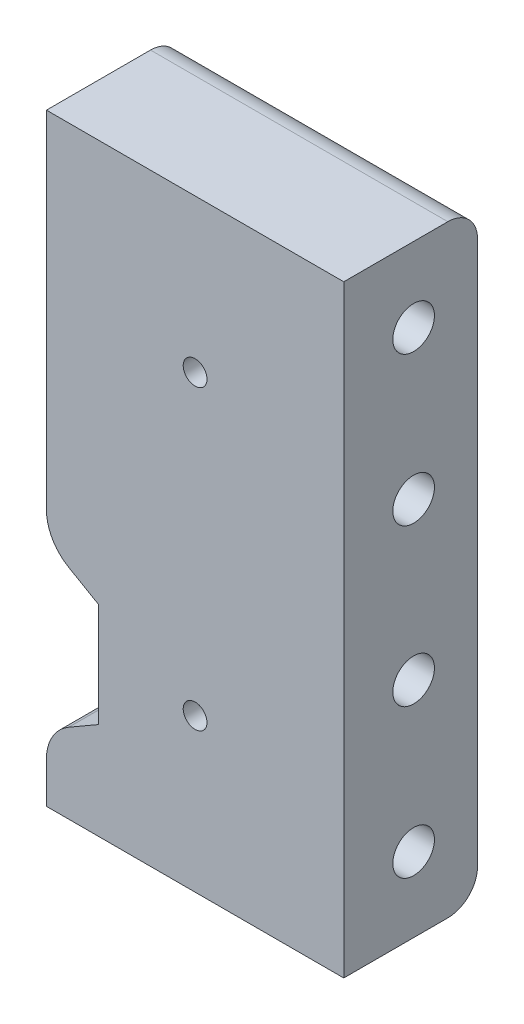
ISO-10303-21;
HEADER;
FILE_DESCRIPTION(('STEP AP214'),'2;1');
FILE_NAME('part.step','',(''),(''),'','','');
FILE_SCHEMA(('AUTOMOTIVE_DESIGN { 1 0 10303 214 1 1 1 1 }'));
ENDSEC;
DATA;
#1=APPLICATION_CONTEXT('core data for automotive mechanical design processes');
#2=APPLICATION_PROTOCOL_DEFINITION('international standard','automotive_design',2000,#1);
#3=PRODUCT_CONTEXT('',#1,'mechanical');
#4=PRODUCT('Part','Part','',(#3));
#5=PRODUCT_RELATED_PRODUCT_CATEGORY('part','',(#4));
#6=PRODUCT_DEFINITION_FORMATION('','',#4);
#7=PRODUCT_DEFINITION_CONTEXT('part definition',#1,'design');
#8=PRODUCT_DEFINITION('design','',#6,#7);
#9=PRODUCT_DEFINITION_SHAPE('','',#8);
#10=(LENGTH_UNIT() NAMED_UNIT(*) SI_UNIT(.MILLI.,.METRE.));
#11=(NAMED_UNIT(*) PLANE_ANGLE_UNIT() SI_UNIT($,.RADIAN.));
#12=(NAMED_UNIT(*) SI_UNIT($,.STERADIAN.) SOLID_ANGLE_UNIT());
#13=UNCERTAINTY_MEASURE_WITH_UNIT(LENGTH_MEASURE(1.E-05),#10,'distance_accuracy_value','');
#14=(GEOMETRIC_REPRESENTATION_CONTEXT(3) GLOBAL_UNCERTAINTY_ASSIGNED_CONTEXT((#13)) GLOBAL_UNIT_ASSIGNED_CONTEXT((#10,
#11,#12)) REPRESENTATION_CONTEXT('',''));
#15=CARTESIAN_POINT('',(0.,0.,0.));
#16=DIRECTION('',(0.,0.,1.));
#17=DIRECTION('',(1.,0.,0.));
#18=AXIS2_PLACEMENT_3D('',#15,#16,#17);
#19=CARTESIAN_POINT('',(-10.,20.28038,-9.));
#20=DIRECTION('',(-1.,0.,0.));
#21=DIRECTION('',(0.,-1.,0.));
#22=AXIS2_PLACEMENT_3D('',#19,#20,#21);
#23=PLANE('',#22);
#24=DIRECTION('',(0.,-1.,0.));
#25=VECTOR('',#24,1.);
#26=CARTESIAN_POINT('',(-10.,20.28038,-18.));
#27=LINE('',#26,#25);
#28=CARTESIAN_POINT('',(-10.,-17.5179467497326,-18.));
#29=VERTEX_POINT('',#28);
#30=CARTESIAN_POINT('',(-10.,-18.28038,-18.));
#31=VERTEX_POINT('',#30);
#32=EDGE_CURVE('E286',#29,#31,#27,.T.);
#33=ORIENTED_EDGE('',*,*,#32,.T.);
#34=CARTESIAN_POINT('',(-10.,-18.28038,-16.));
#35=DIRECTION('',(1.,0.,0.));
#36=DIRECTION('',(0.,-1.,0.));
#37=AXIS2_PLACEMENT_3D('',#34,#35,#36);
#38=CIRCLE('',#37,2.);
#39=CARTESIAN_POINT('',(-10.,-20.28038,-16.));
#40=VERTEX_POINT('',#39);
#41=EDGE_CURVE('E387',#40,#31,#38,.T.);
#42=ORIENTED_EDGE('',*,*,#41,.F.);
#43=DIRECTION('',(0.,0.,-1.));
#44=VECTOR('',#43,1.);
#45=CARTESIAN_POINT('',(-10.,-20.28038,-9.));
#46=LINE('',#45,#44);
#47=CARTESIAN_POINT('',(-10.,-20.28038,-9.));
#48=VERTEX_POINT('',#47);
#49=EDGE_CURVE('E332',#48,#40,#46,.T.);
#50=ORIENTED_EDGE('',*,*,#49,.F.);
#51=DIRECTION('',(0.,-1.,0.));
#52=VECTOR('',#51,1.);
#53=CARTESIAN_POINT('',(-10.,20.28038,-9.));
#54=LINE('',#53,#52);
#55=CARTESIAN_POINT('',(-10.,-17.5179467497326,-9.));
#56=VERTEX_POINT('',#55);
#57=EDGE_CURVE('E310',#56,#48,#54,.T.);
#58=ORIENTED_EDGE('',*,*,#57,.F.);
#59=DIRECTION('',(0.,0.,1.));
#60=VECTOR('',#59,1.);
#61=CARTESIAN_POINT('',(-10.,-17.5179467497326,-9.00000000000001));
#62=LINE('',#61,#60);
#63=EDGE_CURVE('E40',#29,#56,#62,.T.);
#64=ORIENTED_EDGE('',*,*,#63,.F.);
#65=EDGE_LOOP('',(#33,#42,#50,#58,#64));
#66=FACE_BOUND('',#65,.T.);
#67=ADVANCED_FACE('F32',(#66),#23,.T.);
#68=CARTESIAN_POINT('',(0.,0.,-18.));
#69=DIRECTION('',(0.,0.,-1.));
#70=DIRECTION('',(1.,0.,0.));
#71=AXIS2_PLACEMENT_3D('',#68,#69,#70);
#72=PLANE('',#71);
#73=CARTESIAN_POINT('',(-10.,18.28038,-18.));
#74=VERTEX_POINT('',#73);
#75=CARTESIAN_POINT('',(-10.,-3.01239325026743,-18.));
#76=VERTEX_POINT('',#75);
#77=EDGE_CURVE('E320',#74,#76,#27,.T.);
#78=ORIENTED_EDGE('',*,*,#77,.F.);
#79=DIRECTION('',(-1.,0.,0.));
#80=VECTOR('',#79,1.);
#81=CARTESIAN_POINT('',(0.,18.28038,-18.));
#82=LINE('',#81,#80);
#83=CARTESIAN_POINT('',(-1.89479472650733,18.28038,-18.));
#84=VERTEX_POINT('',#83);
#85=EDGE_CURVE('E328',#84,#74,#82,.T.);
#86=ORIENTED_EDGE('',*,*,#85,.F.);
#87=CARTESIAN_POINT('',(0.,16.5,-18.));
#88=DIRECTION('',(0.,0.,1.));
#89=DIRECTION('',(1.,0.,0.));
#90=AXIS2_PLACEMENT_3D('',#87,#88,#89);
#91=CIRCLE('',#90,2.59999999999999);
#92=CARTESIAN_POINT('',(-2.57372786042067,16.8686799431681,-18.));
#93=VERTEX_POINT('',#92);
#94=EDGE_CURVE('E261',#84,#93,#91,.T.);
#95=ORIENTED_EDGE('',*,*,#94,.T.);
#96=DIRECTION('',(-0.141799978141564,-0.989895330931029,0.));
#97=VECTOR('',#96,1.);
#98=CARTESIAN_POINT('',(-2.57372786042067,16.8686799431681,-18.));
#99=LINE('',#98,#97);
#100=CARTESIAN_POINT('',(-4.39446167265914,4.15826966508064,-18.));
#101=VERTEX_POINT('',#100);
#102=EDGE_CURVE('E228',#93,#101,#99,.T.);
#103=ORIENTED_EDGE('',*,*,#102,.T.);
#104=CARTESIAN_POINT('',(0.,0.,-18.));
#105=DIRECTION('',(0.,0.,1.));
#106=DIRECTION('',(1.,0.,0.));
#107=AXIS2_PLACEMENT_3D('',#104,#105,#106);
#108=CIRCLE('',#107,6.05);
#109=CARTESIAN_POINT('',(-4.39446167265914,-4.15826966508064,-18.));
#110=VERTEX_POINT('',#109);
#111=EDGE_CURVE('E219',#101,#110,#108,.T.);
#112=ORIENTED_EDGE('',*,*,#111,.T.);
#113=DIRECTION('',(0.141799978141564,-0.989895330931029,0.));
#114=VECTOR('',#113,1.);
#115=CARTESIAN_POINT('',(-4.39446167265914,-4.15826966508064,-18.));
#116=LINE('',#115,#114);
#117=CARTESIAN_POINT('',(-2.57372786042067,-16.8686799431681,-18.));
#118=VERTEX_POINT('',#117);
#119=EDGE_CURVE('E245',#110,#118,#116,.T.);
#120=ORIENTED_EDGE('',*,*,#119,.T.);
#121=CARTESIAN_POINT('',(0.,-16.5,-18.));
#122=DIRECTION('',(0.,0.,1.));
#123=DIRECTION('',(1.,0.,0.));
#124=AXIS2_PLACEMENT_3D('',#121,#122,#123);
#125=CIRCLE('',#124,2.6);
#126=CARTESIAN_POINT('',(-1.89479472650733,-18.28038,-18.));
#127=VERTEX_POINT('',#126);
#128=EDGE_CURVE('E249',#118,#127,#125,.T.);
#129=ORIENTED_EDGE('',*,*,#128,.T.);
#130=DIRECTION('',(1.,0.,0.));
#131=VECTOR('',#130,1.);
#132=CARTESIAN_POINT('',(0.,-18.28038,-18.));
#133=LINE('',#132,#131);
#134=EDGE_CURVE('E344',#31,#127,#133,.T.);
#135=ORIENTED_EDGE('',*,*,#134,.F.);
#136=ORIENTED_EDGE('',*,*,#32,.F.);
#137=CARTESIAN_POINT('',(-7.,-17.5179467497326,-18.));
#138=DIRECTION('',(0.,0.,1.));
#139=DIRECTION('',(1.,0.,0.));
#140=AXIS2_PLACEMENT_3D('',#137,#138,#139);
#141=CIRCLE('',#140,3.);
#142=CARTESIAN_POINT('',(-8.49999999999999,-14.9198705383793,-18.));
#143=VERTEX_POINT('',#142);
#144=EDGE_CURVE('E452',#143,#29,#141,.T.);
#145=ORIENTED_EDGE('',*,*,#144,.F.);
#146=DIRECTION('',(-0.86602540378444,-0.499999999999998,0.));
#147=VECTOR('',#146,1.);
#148=CARTESIAN_POINT('',(4.33549345370573,-7.50929493770062,-18.));
#149=LINE('',#148,#147);
#150=CARTESIAN_POINT('',(-6.5,-13.76517,-18.));
#151=VERTEX_POINT('',#150);
#152=EDGE_CURVE('E201',#151,#143,#149,.T.);
#153=ORIENTED_EDGE('',*,*,#152,.F.);
#154=DIRECTION('',(0.,1.,0.));
#155=VECTOR('',#154,1.);
#156=CARTESIAN_POINT('',(-6.5,-13.76517,-18.));
#157=LINE('',#156,#155);
#158=CARTESIAN_POINT('',(-6.5,-6.76517,-18.));
#159=VERTEX_POINT('',#158);
#160=EDGE_CURVE('E185',#151,#159,#157,.T.);
#161=ORIENTED_EDGE('',*,*,#160,.T.);
#162=DIRECTION('',(0.866025403784439,-0.499999999999999,0.));
#163=VECTOR('',#162,1.);
#164=CARTESIAN_POINT('',(-4.55440454046017,-7.88846006229943,-18.));
#165=LINE('',#164,#163);
#166=CARTESIAN_POINT('',(-8.5,-5.61046946162075,-18.));
#167=VERTEX_POINT('',#166);
#168=EDGE_CURVE('E194',#167,#159,#165,.T.);
#169=ORIENTED_EDGE('',*,*,#168,.F.);
#170=CARTESIAN_POINT('',(-7.,-3.01239325026743,-18.));
#171=DIRECTION('',(0.,0.,1.));
#172=DIRECTION('',(1.,0.,0.));
#173=AXIS2_PLACEMENT_3D('',#170,#171,#172);
#174=CIRCLE('',#173,3.);
#175=EDGE_CURVE('E454',#76,#167,#174,.T.);
#176=ORIENTED_EDGE('',*,*,#175,.F.);
#177=EDGE_LOOP('',(#78,#86,#95,#103,#112,#120,#129,#135,#136,#145,#153,#161,#169,#176));
#178=FACE_BOUND('',#177,.T.);
#179=ADVANCED_FACE('F204',(#178),#72,.T.);
#180=CARTESIAN_POINT('',(10.,20.28038,-9.));
#181=DIRECTION('',(0.,1.,0.));
#182=DIRECTION('',(0.,0.,-1.));
#183=AXIS2_PLACEMENT_3D('',#180,#181,#182);
#184=PLANE('',#183);
#185=DIRECTION('',(0.,0.,-1.));
#186=VECTOR('',#185,1.);
#187=CARTESIAN_POINT('',(-10.,20.28038,-9.));
#188=LINE('',#187,#186);
#189=CARTESIAN_POINT('',(-10.,20.28038,-9.));
#190=VERTEX_POINT('',#189);
#191=CARTESIAN_POINT('',(-10.,20.28038,-16.));
#192=VERTEX_POINT('',#191);
#193=EDGE_CURVE('E319',#190,#192,#188,.T.);
#194=ORIENTED_EDGE('',*,*,#193,.F.);
#195=DIRECTION('',(-1.,0.,0.));
#196=VECTOR('',#195,1.);
#197=CARTESIAN_POINT('',(10.,20.28038,-9.));
#198=LINE('',#197,#196);
#199=CARTESIAN_POINT('',(10.,20.28038,-9.));
#200=VERTEX_POINT('',#199);
#201=EDGE_CURVE('E307',#200,#190,#198,.T.);
#202=ORIENTED_EDGE('',*,*,#201,.F.);
#203=DIRECTION('',(0.,0.,-1.));
#204=VECTOR('',#203,1.);
#205=CARTESIAN_POINT('',(10.,20.28038,-9.));
#206=LINE('',#205,#204);
#207=CARTESIAN_POINT('',(10.,20.28038,-16.));
#208=VERTEX_POINT('',#207);
#209=EDGE_CURVE('E325',#200,#208,#206,.T.);
#210=ORIENTED_EDGE('',*,*,#209,.T.);
#211=DIRECTION('',(-1.,0.,0.));
#212=VECTOR('',#211,1.);
#213=CARTESIAN_POINT('',(10.,20.28038,-16.));
#214=LINE('',#213,#212);
#215=EDGE_CURVE('E386',#192,#208,#214,.F.);
#216=ORIENTED_EDGE('',*,*,#215,.F.);
#217=EDGE_LOOP('',(#194,#202,#210,#216));
#218=FACE_BOUND('',#217,.T.);
#219=ADVANCED_FACE('F369',(#218),#184,.T.);
#220=CARTESIAN_POINT('',(10.,-20.28038,-9.));
#221=DIRECTION('',(1.,0.,0.));
#222=DIRECTION('',(0.,0.,1.));
#223=AXIS2_PLACEMENT_3D('',#220,#221,#222);
#224=PLANE('',#223);
#225=CARTESIAN_POINT('',(10.,-15.26519,-13.7));
#226=DIRECTION('',(-1.,0.,0.));
#227=DIRECTION('',(0.,0.,-1.));
#228=AXIS2_PLACEMENT_3D('',#225,#226,#227);
#229=CIRCLE('',#228,1.4);
#230=CARTESIAN_POINT('',(10.,-15.26519,-15.1));
#231=VERTEX_POINT('',#230);
#232=EDGE_CURVE('E287',#231,#231,#229,.T.);
#233=ORIENTED_EDGE('',*,*,#232,.T.);
#234=EDGE_LOOP('',(#233));
#235=FACE_BOUND('',#234,.T.);
#236=CARTESIAN_POINT('',(10.,5.26519,-13.7));
#237=DIRECTION('',(-1.,0.,0.));
#238=DIRECTION('',(0.,0.,-1.));
#239=AXIS2_PLACEMENT_3D('',#236,#237,#238);
#240=CIRCLE('',#239,1.4);
#241=CARTESIAN_POINT('',(10.,5.26519,-15.1));
#242=VERTEX_POINT('',#241);
#243=EDGE_CURVE('E269',#242,#242,#240,.T.);
#244=ORIENTED_EDGE('',*,*,#243,.T.);
#245=EDGE_LOOP('',(#244));
#246=FACE_BOUND('',#245,.T.);
#247=CARTESIAN_POINT('',(10.,15.26519,-13.7));
#248=DIRECTION('',(-1.,0.,0.));
#249=DIRECTION('',(0.,0.,1.));
#250=AXIS2_PLACEMENT_3D('',#247,#248,#249);
#251=CIRCLE('',#250,1.4);
#252=CARTESIAN_POINT('',(10.,15.26519,-12.3));
#253=VERTEX_POINT('',#252);
#254=EDGE_CURVE('E294',#253,#253,#251,.T.);
#255=ORIENTED_EDGE('',*,*,#254,.T.);
#256=EDGE_LOOP('',(#255));
#257=FACE_BOUND('',#256,.T.);
#258=CARTESIAN_POINT('',(10.,-5.26519,-13.7));
#259=DIRECTION('',(-1.,0.,0.));
#260=DIRECTION('',(0.,0.,1.));
#261=AXIS2_PLACEMENT_3D('',#258,#259,#260);
#262=CIRCLE('',#261,1.4);
#263=CARTESIAN_POINT('',(10.,-5.26519,-12.3));
#264=VERTEX_POINT('',#263);
#265=EDGE_CURVE('E299',#264,#264,#262,.T.);
#266=ORIENTED_EDGE('',*,*,#265,.T.);
#267=EDGE_LOOP('',(#266));
#268=FACE_BOUND('',#267,.T.);
#269=DIRECTION('',(0.,1.,0.));
#270=VECTOR('',#269,1.);
#271=CARTESIAN_POINT('',(10.,-20.28038,-18.));
#272=LINE('',#271,#270);
#273=CARTESIAN_POINT('',(10.,-18.28038,-18.));
#274=VERTEX_POINT('',#273);
#275=CARTESIAN_POINT('',(10.,18.28038,-18.));
#276=VERTEX_POINT('',#275);
#277=EDGE_CURVE('E311',#274,#276,#272,.T.);
#278=ORIENTED_EDGE('',*,*,#277,.T.);
#279=CARTESIAN_POINT('',(10.,18.28038,-16.));
#280=DIRECTION('',(-1.,0.,0.));
#281=DIRECTION('',(0.,0.,1.));
#282=AXIS2_PLACEMENT_3D('',#279,#280,#281);
#283=CIRCLE('',#282,2.);
#284=EDGE_CURVE('E355',#208,#276,#283,.T.);
#285=ORIENTED_EDGE('',*,*,#284,.F.);
#286=ORIENTED_EDGE('',*,*,#209,.F.);
#287=DIRECTION('',(0.,1.,0.));
#288=VECTOR('',#287,1.);
#289=CARTESIAN_POINT('',(10.,-20.28038,-9.));
#290=LINE('',#289,#288);
#291=CARTESIAN_POINT('',(10.,-20.28038,-9.));
#292=VERTEX_POINT('',#291);
#293=EDGE_CURVE('E317',#292,#200,#290,.T.);
#294=ORIENTED_EDGE('',*,*,#293,.F.);
#295=DIRECTION('',(0.,0.,-1.));
#296=VECTOR('',#295,1.);
#297=CARTESIAN_POINT('',(10.,-20.28038,-9.));
#298=LINE('',#297,#296);
#299=CARTESIAN_POINT('',(10.,-20.28038,-16.));
#300=VERTEX_POINT('',#299);
#301=EDGE_CURVE('E329',#292,#300,#298,.T.);
#302=ORIENTED_EDGE('',*,*,#301,.T.);
#303=CARTESIAN_POINT('',(10.,-18.28038,-16.));
#304=DIRECTION('',(-1.,0.,0.));
#305=DIRECTION('',(0.,0.,1.));
#306=AXIS2_PLACEMENT_3D('',#303,#304,#305);
#307=CIRCLE('',#306,2.);
#308=EDGE_CURVE('E471',#274,#300,#307,.T.);
#309=ORIENTED_EDGE('',*,*,#308,.F.);
#310=EDGE_LOOP('',(#278,#285,#286,#294,#302,#309));
#311=FACE_BOUND('',#310,.T.);
#312=ADVANCED_FACE('F433',(#235,#246,#257,#268,#311),#224,.T.);
#313=CARTESIAN_POINT('',(-10.,-20.28038,-9.));
#314=DIRECTION('',(0.,-1.,0.));
#315=DIRECTION('',(0.,0.,1.));
#316=AXIS2_PLACEMENT_3D('',#313,#314,#315);
#317=PLANE('',#316);
#318=ORIENTED_EDGE('',*,*,#301,.F.);
#319=DIRECTION('',(1.,0.,0.));
#320=VECTOR('',#319,1.);
#321=CARTESIAN_POINT('',(-10.,-20.28038,-9.));
#322=LINE('',#321,#320);
#323=EDGE_CURVE('E315',#48,#292,#322,.T.);
#324=ORIENTED_EDGE('',*,*,#323,.F.);
#325=ORIENTED_EDGE('',*,*,#49,.T.);
#326=DIRECTION('',(1.,0.,0.));
#327=VECTOR('',#326,1.);
#328=CARTESIAN_POINT('',(-10.,-20.28038,-16.));
#329=LINE('',#328,#327);
#330=EDGE_CURVE('E466',#300,#40,#329,.F.);
#331=ORIENTED_EDGE('',*,*,#330,.F.);
#332=EDGE_LOOP('',(#318,#324,#325,#331));
#333=FACE_BOUND('',#332,.T.);
#334=ADVANCED_FACE('F426',(#333),#317,.T.);
#335=CARTESIAN_POINT('',(-10.,-3.01239325026743,-9.));
#336=VERTEX_POINT('',#335);
#337=EDGE_CURVE('E312',#190,#336,#54,.T.);
#338=ORIENTED_EDGE('',*,*,#337,.F.);
#339=ORIENTED_EDGE('',*,*,#193,.T.);
#340=CARTESIAN_POINT('',(-10.,18.28038,-16.));
#341=DIRECTION('',(1.,0.,0.));
#342=DIRECTION('',(0.,-1.,0.));
#343=AXIS2_PLACEMENT_3D('',#340,#341,#342);
#344=CIRCLE('',#343,2.);
#345=EDGE_CURVE('E472',#74,#192,#344,.T.);
#346=ORIENTED_EDGE('',*,*,#345,.F.);
#347=ORIENTED_EDGE('',*,*,#77,.T.);
#348=DIRECTION('',(0.,0.,-1.));
#349=VECTOR('',#348,1.);
#350=CARTESIAN_POINT('',(-10.,-3.01239325026743,-9.00000000000001));
#351=LINE('',#350,#349);
#352=EDGE_CURVE('E200',#336,#76,#351,.T.);
#353=ORIENTED_EDGE('',*,*,#352,.F.);
#354=EDGE_LOOP('',(#338,#339,#346,#347,#353));
#355=FACE_BOUND('',#354,.T.);
#356=ADVANCED_FACE('F416',(#355),#23,.T.);
#357=CARTESIAN_POINT('',(0.,0.,-9.));
#358=DIRECTION('',(0.,0.,-1.));
#359=DIRECTION('',(1.,0.,0.));
#360=AXIS2_PLACEMENT_3D('',#357,#358,#359);
#361=PLANE('',#360);
#362=DIRECTION('',(-0.866025403784439,0.499999999999999,0.));
#363=VECTOR('',#362,1.);
#364=CARTESIAN_POINT('',(-6.49999999999999,-6.76517,-9.));
#365=LINE('',#364,#363);
#366=CARTESIAN_POINT('',(-6.5,-6.76517,-9.));
#367=VERTEX_POINT('',#366);
#368=CARTESIAN_POINT('',(-8.5,-5.61046946162075,-9.));
#369=VERTEX_POINT('',#368);
#370=EDGE_CURVE('E447',#367,#369,#365,.T.);
#371=ORIENTED_EDGE('',*,*,#370,.F.);
#372=DIRECTION('',(0.,-1.,0.));
#373=VECTOR('',#372,1.);
#374=CARTESIAN_POINT('',(-6.5,-6.76517,-9.));
#375=LINE('',#374,#373);
#376=CARTESIAN_POINT('',(-6.5,-13.76517,-9.));
#377=VERTEX_POINT('',#376);
#378=EDGE_CURVE('E188',#367,#377,#375,.T.);
#379=ORIENTED_EDGE('',*,*,#378,.T.);
#380=DIRECTION('',(0.86602540378444,0.499999999999998,0.));
#381=VECTOR('',#380,1.);
#382=CARTESIAN_POINT('',(-6.49999999999997,-13.76517,-9.));
#383=LINE('',#382,#381);
#384=CARTESIAN_POINT('',(-8.49999999999999,-14.9198705383793,-9.));
#385=VERTEX_POINT('',#384);
#386=EDGE_CURVE('E446',#385,#377,#383,.T.);
#387=ORIENTED_EDGE('',*,*,#386,.F.);
#388=CARTESIAN_POINT('',(-7.,-17.5179467497326,-9.));
#389=DIRECTION('',(0.,0.,1.));
#390=DIRECTION('',(1.,0.,0.));
#391=AXIS2_PLACEMENT_3D('',#388,#389,#390);
#392=CIRCLE('',#391,3.);
#393=EDGE_CURVE('E52',#56,#385,#392,.F.);
#394=ORIENTED_EDGE('',*,*,#393,.F.);
#395=ORIENTED_EDGE('',*,*,#57,.T.);
#396=ORIENTED_EDGE('',*,*,#323,.T.);
#397=ORIENTED_EDGE('',*,*,#293,.T.);
#398=ORIENTED_EDGE('',*,*,#201,.T.);
#399=ORIENTED_EDGE('',*,*,#337,.T.);
#400=CARTESIAN_POINT('',(-7.,-3.01239325026743,-9.));
#401=DIRECTION('',(0.,0.,1.));
#402=DIRECTION('',(1.,0.,0.));
#403=AXIS2_PLACEMENT_3D('',#400,#401,#402);
#404=CIRCLE('',#403,3.);
#405=EDGE_CURVE('E458',#369,#336,#404,.F.);
#406=ORIENTED_EDGE('',*,*,#405,.F.);
#407=EDGE_LOOP('',(#371,#379,#387,#394,#395,#396,#397,#398,#399,#406));
#408=FACE_BOUND('',#407,.T.);
#409=CARTESIAN_POINT('',(0.,10.,-9.));
#410=DIRECTION('',(0.,0.,1.));
#411=DIRECTION('',(1.,0.,0.));
#412=AXIS2_PLACEMENT_3D('',#409,#410,#411);
#413=CIRCLE('',#412,0.8);
#414=CARTESIAN_POINT('',(0.800000000000001,10.,-9.));
#415=VERTEX_POINT('',#414);
#416=EDGE_CURVE('E215',#415,#415,#413,.F.);
#417=ORIENTED_EDGE('',*,*,#416,.T.);
#418=EDGE_LOOP('',(#417));
#419=FACE_BOUND('',#418,.T.);
#420=CARTESIAN_POINT('',(0.,-10.,-9.));
#421=DIRECTION('',(0.,0.,1.));
#422=DIRECTION('',(1.,0.,0.));
#423=AXIS2_PLACEMENT_3D('',#420,#421,#422);
#424=CIRCLE('',#423,0.8);
#425=CARTESIAN_POINT('',(0.800000000000001,-10.,-9.));
#426=VERTEX_POINT('',#425);
#427=EDGE_CURVE('E216',#426,#426,#424,.F.);
#428=ORIENTED_EDGE('',*,*,#427,.T.);
#429=EDGE_LOOP('',(#428));
#430=FACE_BOUND('',#429,.T.);
#431=ADVANCED_FACE('F425',(#408,#419,#430),#361,.F.);
#432=CARTESIAN_POINT('',(1.89479472650734,-18.28038,-18.));
#433=VERTEX_POINT('',#432);
#434=CARTESIAN_POINT('',(2.57372786042068,-16.8686799431681,-18.));
#435=VERTEX_POINT('',#434);
#436=EDGE_CURVE('E248',#433,#435,#125,.T.);
#437=ORIENTED_EDGE('',*,*,#436,.T.);
#438=DIRECTION('',(0.141799978141564,0.989895330931029,0.));
#439=VECTOR('',#438,1.);
#440=CARTESIAN_POINT('',(2.57372786042068,-16.8686799431681,-18.));
#441=LINE('',#440,#439);
#442=CARTESIAN_POINT('',(4.39446167265914,-4.15826966508063,-18.));
#443=VERTEX_POINT('',#442);
#444=EDGE_CURVE('E252',#435,#443,#441,.T.);
#445=ORIENTED_EDGE('',*,*,#444,.T.);
#446=CARTESIAN_POINT('',(0.,0.,-18.));
#447=DIRECTION('',(0.,0.,1.));
#448=DIRECTION('',(1.,0.,0.));
#449=AXIS2_PLACEMENT_3D('',#446,#447,#448);
#450=CIRCLE('',#449,6.04999999999999);
#451=CARTESIAN_POINT('',(4.39446167265914,4.15826966508064,-18.));
#452=VERTEX_POINT('',#451);
#453=EDGE_CURVE('E255',#443,#452,#450,.T.);
#454=ORIENTED_EDGE('',*,*,#453,.T.);
#455=DIRECTION('',(-0.141799978141564,0.989895330931029,0.));
#456=VECTOR('',#455,1.);
#457=CARTESIAN_POINT('',(4.39446167265914,4.15826966508064,-18.));
#458=LINE('',#457,#456);
#459=CARTESIAN_POINT('',(2.57372786042067,16.8686799431681,-18.));
#460=VERTEX_POINT('',#459);
#461=EDGE_CURVE('E258',#452,#460,#458,.T.);
#462=ORIENTED_EDGE('',*,*,#461,.T.);
#463=CARTESIAN_POINT('',(1.89479472650733,18.28038,-18.));
#464=VERTEX_POINT('',#463);
#465=EDGE_CURVE('E262',#460,#464,#91,.T.);
#466=ORIENTED_EDGE('',*,*,#465,.T.);
#467=DIRECTION('',(-1.,0.,0.));
#468=VECTOR('',#467,1.);
#469=CARTESIAN_POINT('',(0.,18.28038,-18.));
#470=LINE('',#469,#468);
#471=EDGE_CURVE('E339',#276,#464,#470,.T.);
#472=ORIENTED_EDGE('',*,*,#471,.F.);
#473=ORIENTED_EDGE('',*,*,#277,.F.);
#474=DIRECTION('',(1.,0.,0.));
#475=VECTOR('',#474,1.);
#476=CARTESIAN_POINT('',(0.,-18.28038,-18.));
#477=LINE('',#476,#475);
#478=EDGE_CURVE('E342',#433,#274,#477,.T.);
#479=ORIENTED_EDGE('',*,*,#478,.F.);
#480=EDGE_LOOP('',(#437,#445,#454,#462,#466,#472,#473,#479));
#481=FACE_BOUND('',#480,.T.);
#482=ADVANCED_FACE('F421',(#481),#72,.T.);
#483=CARTESIAN_POINT('',(0.,-5.26519,-13.7));
#484=DIRECTION('',(1.,0.,0.));
#485=DIRECTION('',(0.,0.,1.));
#486=AXIS2_PLACEMENT_3D('',#483,#484,#485);
#487=CYLINDRICAL_SURFACE('',#486,1.4);
#488=CARTESIAN_POINT('',(0.,-5.26519,-13.7));
#489=DIRECTION('',(-1.,0.,0.));
#490=DIRECTION('',(0.,0.,1.));
#491=AXIS2_PLACEMENT_3D('',#488,#489,#490);
#492=CIRCLE('',#491,1.4);
#493=CARTESIAN_POINT('',(0.,-5.26519,-12.3));
#494=VERTEX_POINT('',#493);
#495=EDGE_CURVE('E290',#494,#494,#492,.T.);
#496=ORIENTED_EDGE('',*,*,#495,.T.);
#497=EDGE_LOOP('',(#496));
#498=FACE_BOUND('',#497,.T.);
#499=ORIENTED_EDGE('',*,*,#265,.F.);
#500=EDGE_LOOP('',(#499));
#501=FACE_BOUND('',#500,.T.);
#502=ADVANCED_FACE('F561',(#498,#501),#487,.F.);
#503=CARTESIAN_POINT('',(0.,-5.26519,-13.7));
#504=DIRECTION('',(1.,0.,0.));
#505=DIRECTION('',(0.,0.,1.));
#506=AXIS2_PLACEMENT_3D('',#503,#504,#505);
#507=PLANE('',#506);
#508=ORIENTED_EDGE('',*,*,#495,.F.);
#509=EDGE_LOOP('',(#508));
#510=FACE_BOUND('',#509,.T.);
#511=ADVANCED_FACE('F557',(#510),#507,.T.);
#512=CARTESIAN_POINT('',(0.,15.26519,-13.7));
#513=DIRECTION('',(1.,0.,0.));
#514=DIRECTION('',(0.,0.,1.));
#515=AXIS2_PLACEMENT_3D('',#512,#513,#514);
#516=CYLINDRICAL_SURFACE('',#515,1.4);
#517=CARTESIAN_POINT('',(0.,15.26519,-13.7));
#518=DIRECTION('',(-1.,0.,0.));
#519=DIRECTION('',(0.,0.,1.));
#520=AXIS2_PLACEMENT_3D('',#517,#518,#519);
#521=CIRCLE('',#520,1.4);
#522=CARTESIAN_POINT('',(0.,15.26519,-12.3));
#523=VERTEX_POINT('',#522);
#524=EDGE_CURVE('E302',#523,#523,#521,.T.);
#525=ORIENTED_EDGE('',*,*,#524,.T.);
#526=EDGE_LOOP('',(#525));
#527=FACE_BOUND('',#526,.T.);
#528=ORIENTED_EDGE('',*,*,#254,.F.);
#529=EDGE_LOOP('',(#528));
#530=FACE_BOUND('',#529,.T.);
#531=ADVANCED_FACE('F560',(#527,#530),#516,.F.);
#532=CARTESIAN_POINT('',(0.,15.26519,-13.7));
#533=DIRECTION('',(1.,0.,0.));
#534=DIRECTION('',(0.,0.,1.));
#535=AXIS2_PLACEMENT_3D('',#532,#533,#534);
#536=PLANE('',#535);
#537=ORIENTED_EDGE('',*,*,#524,.F.);
#538=EDGE_LOOP('',(#537));
#539=FACE_BOUND('',#538,.T.);
#540=ADVANCED_FACE('F555',(#539),#536,.T.);
#541=CARTESIAN_POINT('',(0.,5.26519,-13.7));
#542=DIRECTION('',(1.,0.,0.));
#543=DIRECTION('',(0.,0.,1.));
#544=AXIS2_PLACEMENT_3D('',#541,#542,#543);
#545=CYLINDRICAL_SURFACE('',#544,1.4);
#546=CARTESIAN_POINT('',(0.,5.26519,-13.7));
#547=DIRECTION('',(-1.,0.,0.));
#548=DIRECTION('',(0.,0.,-1.));
#549=AXIS2_PLACEMENT_3D('',#546,#547,#548);
#550=CIRCLE('',#549,1.4);
#551=CARTESIAN_POINT('',(0.,5.26519,-15.1));
#552=VERTEX_POINT('',#551);
#553=EDGE_CURVE('E291',#552,#552,#550,.T.);
#554=ORIENTED_EDGE('',*,*,#553,.T.);
#555=EDGE_LOOP('',(#554));
#556=FACE_BOUND('',#555,.T.);
#557=ORIENTED_EDGE('',*,*,#243,.F.);
#558=EDGE_LOOP('',(#557));
#559=FACE_BOUND('',#558,.T.);
#560=ADVANCED_FACE('F551',(#556,#559),#545,.F.);
#561=CARTESIAN_POINT('',(0.,5.26519,-13.7));
#562=DIRECTION('',(-1.,0.,0.));
#563=DIRECTION('',(0.,0.,-1.));
#564=AXIS2_PLACEMENT_3D('',#561,#562,#563);
#565=PLANE('',#564);
#566=ORIENTED_EDGE('',*,*,#553,.F.);
#567=EDGE_LOOP('',(#566));
#568=FACE_BOUND('',#567,.T.);
#569=ADVANCED_FACE('F547',(#568),#565,.F.);
#570=CARTESIAN_POINT('',(0.,-15.26519,-13.7));
#571=DIRECTION('',(1.,0.,0.));
#572=DIRECTION('',(0.,0.,1.));
#573=AXIS2_PLACEMENT_3D('',#570,#571,#572);
#574=CYLINDRICAL_SURFACE('',#573,1.4);
#575=CARTESIAN_POINT('',(0.,-15.26519,-13.7));
#576=DIRECTION('',(-1.,0.,0.));
#577=DIRECTION('',(0.,0.,-1.));
#578=AXIS2_PLACEMENT_3D('',#575,#576,#577);
#579=CIRCLE('',#578,1.4);
#580=CARTESIAN_POINT('',(0.,-15.26519,-15.1));
#581=VERTEX_POINT('',#580);
#582=EDGE_CURVE('E283',#581,#581,#579,.T.);
#583=ORIENTED_EDGE('',*,*,#582,.T.);
#584=EDGE_LOOP('',(#583));
#585=FACE_BOUND('',#584,.T.);
#586=ORIENTED_EDGE('',*,*,#232,.F.);
#587=EDGE_LOOP('',(#586));
#588=FACE_BOUND('',#587,.T.);
#589=ADVANCED_FACE('F541',(#585,#588),#574,.F.);
#590=CARTESIAN_POINT('',(0.,-15.26519,-13.7));
#591=DIRECTION('',(-1.,0.,0.));
#592=DIRECTION('',(0.,0.,-1.));
#593=AXIS2_PLACEMENT_3D('',#590,#591,#592);
#594=PLANE('',#593);
#595=ORIENTED_EDGE('',*,*,#582,.F.);
#596=EDGE_LOOP('',(#595));
#597=FACE_BOUND('',#596,.T.);
#598=ADVANCED_FACE('F536',(#597),#594,.F.);
#599=CARTESIAN_POINT('',(0.,0.,-15.5));
#600=DIRECTION('',(0.,0.,-1.));
#601=DIRECTION('',(1.,0.,0.));
#602=AXIS2_PLACEMENT_3D('',#599,#600,#601);
#603=CYLINDRICAL_SURFACE('',#602,6.05);
#604=ORIENTED_EDGE('',*,*,#111,.F.);
#605=DIRECTION('',(0.,0.,-1.));
#606=VECTOR('',#605,1.);
#607=CARTESIAN_POINT('',(-4.39446167265914,4.15826966508064,-15.5));
#608=LINE('',#607,#606);
#609=CARTESIAN_POINT('',(-4.39446167265914,4.15826966508064,-15.5));
#610=VERTEX_POINT('',#609);
#611=EDGE_CURVE('E267',#610,#101,#608,.T.);
#612=ORIENTED_EDGE('',*,*,#611,.F.);
#613=CARTESIAN_POINT('',(0.,0.,-15.5));
#614=DIRECTION('',(0.,0.,1.));
#615=DIRECTION('',(1.,0.,0.));
#616=AXIS2_PLACEMENT_3D('',#613,#614,#615);
#617=CIRCLE('',#616,6.05);
#618=CARTESIAN_POINT('',(-4.39446167265914,-4.15826966508064,-15.5));
#619=VERTEX_POINT('',#618);
#620=EDGE_CURVE('E224',#610,#619,#617,.T.);
#621=ORIENTED_EDGE('',*,*,#620,.T.);
#622=DIRECTION('',(0.,0.,-1.));
#623=VECTOR('',#622,1.);
#624=CARTESIAN_POINT('',(-4.39446167265914,-4.15826966508064,-15.5));
#625=LINE('',#624,#623);
#626=EDGE_CURVE('E242',#619,#110,#625,.T.);
#627=ORIENTED_EDGE('',*,*,#626,.T.);
#628=EDGE_LOOP('',(#604,#612,#621,#627));
#629=FACE_BOUND('',#628,.T.);
#630=ADVANCED_FACE('F530',(#629),#603,.F.);
#631=CARTESIAN_POINT('',(-2.57372786042067,16.8686799431681,-15.5));
#632=DIRECTION('',(-0.989895330931029,0.141799978141564,0.));
#633=DIRECTION('',(-0.141799978141564,-0.989895330931029,0.));
#634=AXIS2_PLACEMENT_3D('',#631,#632,#633);
#635=PLANE('',#634);
#636=ORIENTED_EDGE('',*,*,#102,.F.);
#637=DIRECTION('',(0.,0.,-1.));
#638=VECTOR('',#637,1.);
#639=CARTESIAN_POINT('',(-2.57372786042067,16.8686799431681,-15.5));
#640=LINE('',#639,#638);
#641=CARTESIAN_POINT('',(-2.57372786042067,16.8686799431681,-15.5));
#642=VERTEX_POINT('',#641);
#643=EDGE_CURVE('E270',#642,#93,#640,.T.);
#644=ORIENTED_EDGE('',*,*,#643,.F.);
#645=DIRECTION('',(-0.141799978141564,-0.989895330931029,0.));
#646=VECTOR('',#645,1.);
#647=CARTESIAN_POINT('',(-2.57372786042067,16.8686799431681,-15.5));
#648=LINE('',#647,#646);
#649=EDGE_CURVE('E240',#642,#610,#648,.T.);
#650=ORIENTED_EDGE('',*,*,#649,.T.);
#651=ORIENTED_EDGE('',*,*,#611,.T.);
#652=EDGE_LOOP('',(#636,#644,#650,#651));
#653=FACE_BOUND('',#652,.T.);
#654=ADVANCED_FACE('F396',(#653),#635,.F.);
#655=CARTESIAN_POINT('',(0.,16.5,-15.5));
#656=DIRECTION('',(0.,0.,-1.));
#657=DIRECTION('',(1.,0.,0.));
#658=AXIS2_PLACEMENT_3D('',#655,#656,#657);
#659=CYLINDRICAL_SURFACE('',#658,2.59999999999999);
#660=ORIENTED_EDGE('',*,*,#465,.F.);
#661=DIRECTION('',(0.,0.,-1.));
#662=VECTOR('',#661,1.);
#663=CARTESIAN_POINT('',(2.57372786042067,16.8686799431681,-15.5));
#664=LINE('',#663,#662);
#665=CARTESIAN_POINT('',(2.57372786042067,16.8686799431681,-15.5));
#666=VERTEX_POINT('',#665);
#667=EDGE_CURVE('E272',#666,#460,#664,.T.);
#668=ORIENTED_EDGE('',*,*,#667,.F.);
#669=CARTESIAN_POINT('',(0.,16.5,-15.5));
#670=DIRECTION('',(0.,0.,1.));
#671=DIRECTION('',(1.,0.,0.));
#672=AXIS2_PLACEMENT_3D('',#669,#670,#671);
#673=CIRCLE('',#672,2.59999999999999);
#674=EDGE_CURVE('E238',#666,#642,#673,.T.);
#675=ORIENTED_EDGE('',*,*,#674,.T.);
#676=ORIENTED_EDGE('',*,*,#643,.T.);
#677=ORIENTED_EDGE('',*,*,#94,.F.);
#678=CARTESIAN_POINT('',(1.89479472650733,18.28038,-18.));
#679=CARTESIAN_POINT('',(1.84694500002544,18.3313108829331,-17.9999960902871));
#680=CARTESIAN_POINT('',(1.79708632907066,18.3802519700949,-17.9980557306313));
#681=CARTESIAN_POINT('',(1.69376675598052,18.4738296004288,-17.9911750794141));
#682=CARTESIAN_POINT('',(1.64030994642516,18.5184708982587,-17.9862381466013));
#683=CARTESIAN_POINT('',(1.47519221199742,18.6454728915749,-17.9682523564046));
#684=CARTESIAN_POINT('',(1.35861178618482,18.7210941207688,-17.9520223163716));
#685=CARTESIAN_POINT('',(1.11565029927771,18.8525288427453,-17.9176170218092));
#686=CARTESIAN_POINT('',(0.989299746677925,18.9084011838737,-17.8994477601527));
#687=CARTESIAN_POINT('',(0.728805295340152,18.9995632725926,-17.8668554849539));
#688=CARTESIAN_POINT('',(0.594663710975097,19.0348590985215,-17.852431365789));
#689=CARTESIAN_POINT('',(0.386548840183479,19.0721436835492,-17.8366506599417));
#690=CARTESIAN_POINT('',(0.314128091868952,19.0819899844464,-17.8323402309105));
#691=CARTESIAN_POINT('',(0.168586492420803,19.0955564064587,-17.8263483003385));
#692=CARTESIAN_POINT('',(0.0954656340431241,19.0992764641163,-17.8246668260294));
#693=CARTESIAN_POINT('',(-0.0508242580505365,19.1005319119528,-17.8241028872977));
#694=CARTESIAN_POINT('',(-0.123993277763637,19.0980686521936,-17.8252198118742));
#695=CARTESIAN_POINT('',(-0.26975385277097,19.0870025331249,-17.8301342306685));
#696=CARTESIAN_POINT('',(-0.342345423371447,19.0783998371033,-17.8339316535941));
#697=CARTESIAN_POINT('',(-0.546849315509847,19.0453725815766,-17.8480701173804));
#698=CARTESIAN_POINT('',(-0.677472165633759,19.0137299696958,-17.8612280589008));
#699=CARTESIAN_POINT('',(-0.931803647180486,18.9309875601964,-17.8917256471022));
#700=CARTESIAN_POINT('',(-1.05550783965707,18.879875431688,-17.9090679413583));
#701=CARTESIAN_POINT('',(-1.30844860158109,18.7517510108182,-17.9449303220821));
#702=CARTESIAN_POINT('',(-1.43651069334355,18.6723351896903,-17.9633349586905));
#703=CARTESIAN_POINT('',(-1.61736209123777,18.5371145343079,-17.9839777660575));
#704=CARTESIAN_POINT('',(-1.67583447581399,18.4892923215747,-17.9897006299971));
#705=CARTESIAN_POINT('',(-1.78859161681478,18.3885617067287,-17.9977109836237));
#706=CARTESIAN_POINT('',(-1.84287117934179,18.3356471729836,-17.9999942752605));
#707=CARTESIAN_POINT('',(-1.89479472650733,18.28038,-18.));
#708=B_SPLINE_CURVE_WITH_KNOTS('',3,(#678,#679,#680,#681,#682,#683,#684,#685,#686,#687,#688,
#689,#690,#691,#692,#693,#694,#695,#696,#697,#698,#699,#700,#701,#702,#703,#704,#705,#706,#707),
.UNSPECIFIED.,.F.,.F.,(4,2,2,2,2,2,2,2,2,2,2,2,2,2,4),(0.,0.209441103614172,0.418647884803909,
0.83631897898521,1.2527347781691,1.66902750498688,1.88840890293346,2.10779257328374,
2.32712834769319,2.54645828874162,2.94966853699525,3.35313458154433,3.80595770437823,
4.03290442101192,4.26012790577314),.UNSPECIFIED.);
#709=EDGE_CURVE('E378',#464,#84,#708,.T.);
#710=ORIENTED_EDGE('',*,*,#709,.F.);
#711=EDGE_LOOP('',(#660,#668,#675,#676,#677,#710));
#712=FACE_BOUND('',#711,.T.);
#713=ADVANCED_FACE('F390',(#712),#659,.F.);
#714=CARTESIAN_POINT('',(4.39446167265914,4.15826966508064,-15.5));
#715=DIRECTION('',(0.989895330931029,0.141799978141564,0.));
#716=DIRECTION('',(-0.141799978141564,0.989895330931029,0.));
#717=AXIS2_PLACEMENT_3D('',#714,#715,#716);
#718=PLANE('',#717);
#719=ORIENTED_EDGE('',*,*,#461,.F.);
#720=DIRECTION('',(0.,0.,-1.));
#721=VECTOR('',#720,1.);
#722=CARTESIAN_POINT('',(4.39446167265914,4.15826966508064,-15.5));
#723=LINE('',#722,#721);
#724=CARTESIAN_POINT('',(4.39446167265914,4.15826966508064,-15.5));
#725=VERTEX_POINT('',#724);
#726=EDGE_CURVE('E274',#725,#452,#723,.T.);
#727=ORIENTED_EDGE('',*,*,#726,.F.);
#728=DIRECTION('',(-0.141799978141564,0.989895330931029,0.));
#729=VECTOR('',#728,1.);
#730=CARTESIAN_POINT('',(4.39446167265914,4.15826966508064,-15.5));
#731=LINE('',#730,#729);
#732=EDGE_CURVE('E236',#725,#666,#731,.T.);
#733=ORIENTED_EDGE('',*,*,#732,.T.);
#734=ORIENTED_EDGE('',*,*,#667,.T.);
#735=EDGE_LOOP('',(#719,#727,#733,#734));
#736=FACE_BOUND('',#735,.T.);
#737=ADVANCED_FACE('F395',(#736),#718,.F.);
#738=CARTESIAN_POINT('',(0.,0.,-15.5));
#739=DIRECTION('',(0.,0.,-1.));
#740=DIRECTION('',(1.,0.,0.));
#741=AXIS2_PLACEMENT_3D('',#738,#739,#740);
#742=CYLINDRICAL_SURFACE('',#741,6.04999999999999);
#743=ORIENTED_EDGE('',*,*,#453,.F.);
#744=DIRECTION('',(0.,0.,-1.));
#745=VECTOR('',#744,1.);
#746=CARTESIAN_POINT('',(4.39446167265914,-4.15826966508063,-15.5));
#747=LINE('',#746,#745);
#748=CARTESIAN_POINT('',(4.39446167265914,-4.15826966508063,-15.5));
#749=VERTEX_POINT('',#748);
#750=EDGE_CURVE('E276',#749,#443,#747,.T.);
#751=ORIENTED_EDGE('',*,*,#750,.F.);
#752=CARTESIAN_POINT('',(0.,0.,-15.5));
#753=DIRECTION('',(0.,0.,1.));
#754=DIRECTION('',(1.,0.,0.));
#755=AXIS2_PLACEMENT_3D('',#752,#753,#754);
#756=CIRCLE('',#755,6.04999999999999);
#757=EDGE_CURVE('E234',#749,#725,#756,.T.);
#758=ORIENTED_EDGE('',*,*,#757,.T.);
#759=ORIENTED_EDGE('',*,*,#726,.T.);
#760=EDGE_LOOP('',(#743,#751,#758,#759));
#761=FACE_BOUND('',#760,.T.);
#762=ADVANCED_FACE('F401',(#761),#742,.F.);
#763=CARTESIAN_POINT('',(2.57372786042068,-16.8686799431681,-15.5));
#764=DIRECTION('',(0.989895330931029,-0.141799978141564,0.));
#765=DIRECTION('',(0.141799978141564,0.989895330931029,0.));
#766=AXIS2_PLACEMENT_3D('',#763,#764,#765);
#767=PLANE('',#766);
#768=ORIENTED_EDGE('',*,*,#444,.F.);
#769=DIRECTION('',(0.,0.,-1.));
#770=VECTOR('',#769,1.);
#771=CARTESIAN_POINT('',(2.57372786042068,-16.8686799431681,-15.5));
#772=LINE('',#771,#770);
#773=CARTESIAN_POINT('',(2.57372786042068,-16.8686799431681,-15.5));
#774=VERTEX_POINT('',#773);
#775=EDGE_CURVE('E278',#774,#435,#772,.T.);
#776=ORIENTED_EDGE('',*,*,#775,.F.);
#777=DIRECTION('',(0.141799978141564,0.989895330931029,0.));
#778=VECTOR('',#777,1.);
#779=CARTESIAN_POINT('',(2.57372786042068,-16.8686799431681,-15.5));
#780=LINE('',#779,#778);
#781=EDGE_CURVE('E232',#774,#749,#780,.T.);
#782=ORIENTED_EDGE('',*,*,#781,.T.);
#783=ORIENTED_EDGE('',*,*,#750,.T.);
#784=EDGE_LOOP('',(#768,#776,#782,#783));
#785=FACE_BOUND('',#784,.T.);
#786=ADVANCED_FACE('F404',(#785),#767,.F.);
#787=CARTESIAN_POINT('',(0.,-16.5,-15.5));
#788=DIRECTION('',(0.,0.,-1.));
#789=DIRECTION('',(1.,0.,0.));
#790=AXIS2_PLACEMENT_3D('',#787,#788,#789);
#791=CYLINDRICAL_SURFACE('',#790,2.6);
#792=ORIENTED_EDGE('',*,*,#128,.F.);
#793=DIRECTION('',(0.,0.,-1.));
#794=VECTOR('',#793,1.);
#795=CARTESIAN_POINT('',(-2.57372786042067,-16.8686799431681,-15.5));
#796=LINE('',#795,#794);
#797=CARTESIAN_POINT('',(-2.57372786042067,-16.8686799431681,-15.5));
#798=VERTEX_POINT('',#797);
#799=EDGE_CURVE('E280',#798,#118,#796,.T.);
#800=ORIENTED_EDGE('',*,*,#799,.F.);
#801=CARTESIAN_POINT('',(0.,-16.5,-15.5));
#802=DIRECTION('',(0.,0.,1.));
#803=DIRECTION('',(1.,0.,0.));
#804=AXIS2_PLACEMENT_3D('',#801,#802,#803);
#805=CIRCLE('',#804,2.6);
#806=EDGE_CURVE('E230',#798,#774,#805,.T.);
#807=ORIENTED_EDGE('',*,*,#806,.T.);
#808=ORIENTED_EDGE('',*,*,#775,.T.);
#809=ORIENTED_EDGE('',*,*,#436,.F.);
#810=CARTESIAN_POINT('',(-1.89479472650733,-18.28038,-18.));
#811=CARTESIAN_POINT('',(-1.84694500002544,-18.3313108829331,-17.9999960902871));
#812=CARTESIAN_POINT('',(-1.79708632907066,-18.3802519700949,-17.9980557306313));
#813=CARTESIAN_POINT('',(-1.69376675598052,-18.4738296004288,-17.9911750794141));
#814=CARTESIAN_POINT('',(-1.64030994642516,-18.5184708982587,-17.9862381466013));
#815=CARTESIAN_POINT('',(-1.47519221199741,-18.6454728915749,-17.9682523564046));
#816=CARTESIAN_POINT('',(-1.35861178618482,-18.7210941207688,-17.9520223163716));
#817=CARTESIAN_POINT('',(-1.11565029927771,-18.8525288427453,-17.9176170218092));
#818=CARTESIAN_POINT('',(-0.98929974667792,-18.9084011838737,-17.8994477601527));
#819=CARTESIAN_POINT('',(-0.728805295340147,-18.9995632725926,-17.8668554849539));
#820=CARTESIAN_POINT('',(-0.594663710975091,-19.0348590985215,-17.852431365789));
#821=CARTESIAN_POINT('',(-0.386548840183473,-19.0721436835492,-17.8366506599417));
#822=CARTESIAN_POINT('',(-0.314128091868945,-19.0819899844464,-17.8323402309105));
#823=CARTESIAN_POINT('',(-0.168586492420796,-19.0955564064587,-17.8263483003385));
#824=CARTESIAN_POINT('',(-0.0954656340431169,-19.0992764641163,-17.8246668260294));
#825=CARTESIAN_POINT('',(0.0508242580505437,-19.1005319119528,-17.8241028872977));
#826=CARTESIAN_POINT('',(0.123993277763644,-19.0980686521936,-17.8252198118742));
#827=CARTESIAN_POINT('',(0.269753852770978,-19.0870025331249,-17.8301342306685));
#828=CARTESIAN_POINT('',(0.342345423371454,-19.0783998371033,-17.8339316535941));
#829=CARTESIAN_POINT('',(0.546849315509855,-19.0453725815766,-17.8480701173804));
#830=CARTESIAN_POINT('',(0.677472165633767,-19.0137299696958,-17.8612280589008));
#831=CARTESIAN_POINT('',(0.931803647180495,-18.9309875601964,-17.8917256471022));
#832=CARTESIAN_POINT('',(1.05550783965708,-18.879875431688,-17.9090679413583));
#833=CARTESIAN_POINT('',(1.30844860158109,-18.7517510108182,-17.9449303220821));
#834=CARTESIAN_POINT('',(1.43651069334356,-18.6723351896903,-17.9633349586905));
#835=CARTESIAN_POINT('',(1.61736209123778,-18.5371145343079,-17.9839777660575));
#836=CARTESIAN_POINT('',(1.675834475814,-18.4892923215747,-17.9897006299971));
#837=CARTESIAN_POINT('',(1.78859161681479,-18.3885617067287,-17.9977109836237));
#838=CARTESIAN_POINT('',(1.8428711793418,-18.3356471729836,-17.9999942752605));
#839=CARTESIAN_POINT('',(1.89479472650734,-18.28038,-18.));
#840=B_SPLINE_CURVE_WITH_KNOTS('',3,(#810,#811,#812,#813,#814,#815,#816,#817,#818,#819,#820,
#821,#822,#823,#824,#825,#826,#827,#828,#829,#830,#831,#832,#833,#834,#835,#836,#837,#838,#839),
.UNSPECIFIED.,.F.,.F.,(4,2,2,2,2,2,2,2,2,2,2,2,2,2,4),(0.,0.209441103614168,0.418647884803905,
0.836318978985208,1.2527347781691,1.66902750498688,1.88840890293346,2.10779257328374,
2.32712834769319,2.54645828874162,2.94966853699525,3.35313458154433,3.80595770437823,
4.03290442101192,4.26012790577314),.UNSPECIFIED.);
#841=EDGE_CURVE('E347',#127,#433,#840,.T.);
#842=ORIENTED_EDGE('',*,*,#841,.F.);
#843=EDGE_LOOP('',(#792,#800,#807,#808,#809,#842));
#844=FACE_BOUND('',#843,.T.);
#845=ADVANCED_FACE('F357',(#844),#791,.F.);
#846=CARTESIAN_POINT('',(-4.39446167265914,-4.15826966508064,-15.5));
#847=DIRECTION('',(-0.989895330931029,-0.141799978141564,0.));
#848=DIRECTION('',(0.141799978141564,-0.989895330931029,0.));
#849=AXIS2_PLACEMENT_3D('',#846,#847,#848);
#850=PLANE('',#849);
#851=ORIENTED_EDGE('',*,*,#119,.F.);
#852=ORIENTED_EDGE('',*,*,#626,.F.);
#853=DIRECTION('',(0.141799978141564,-0.989895330931029,0.));
#854=VECTOR('',#853,1.);
#855=CARTESIAN_POINT('',(-4.39446167265914,-4.15826966508064,-15.5));
#856=LINE('',#855,#854);
#857=EDGE_CURVE('E227',#619,#798,#856,.T.);
#858=ORIENTED_EDGE('',*,*,#857,.T.);
#859=ORIENTED_EDGE('',*,*,#799,.T.);
#860=EDGE_LOOP('',(#851,#852,#858,#859));
#861=FACE_BOUND('',#860,.T.);
#862=ADVANCED_FACE('F411',(#861),#850,.F.);
#863=CARTESIAN_POINT('',(0.,0.,-15.5));
#864=DIRECTION('',(0.,0.,-1.));
#865=DIRECTION('',(1.,0.,0.));
#866=AXIS2_PLACEMENT_3D('',#863,#864,#865);
#867=PLANE('',#866);
#868=CARTESIAN_POINT('',(0.,10.,-15.5));
#869=DIRECTION('',(0.,0.,1.));
#870=DIRECTION('',(1.,0.,0.));
#871=AXIS2_PLACEMENT_3D('',#868,#869,#870);
#872=CIRCLE('',#871,0.8);
#873=CARTESIAN_POINT('',(0.800000000000001,10.,-15.5));
#874=VERTEX_POINT('',#873);
#875=EDGE_CURVE('E212',#874,#874,#872,.T.);
#876=ORIENTED_EDGE('',*,*,#875,.T.);
#877=EDGE_LOOP('',(#876));
#878=FACE_BOUND('',#877,.T.);
#879=CARTESIAN_POINT('',(0.,-10.,-15.5));
#880=DIRECTION('',(0.,0.,1.));
#881=DIRECTION('',(-1.,0.,0.));
#882=AXIS2_PLACEMENT_3D('',#879,#880,#881);
#883=CIRCLE('',#882,0.8);
#884=CARTESIAN_POINT('',(-0.799999999999999,-10.,-15.5));
#885=VERTEX_POINT('',#884);
#886=EDGE_CURVE('E211',#885,#885,#883,.T.);
#887=ORIENTED_EDGE('',*,*,#886,.T.);
#888=EDGE_LOOP('',(#887));
#889=FACE_BOUND('',#888,.T.);
#890=ORIENTED_EDGE('',*,*,#620,.F.);
#891=ORIENTED_EDGE('',*,*,#649,.F.);
#892=ORIENTED_EDGE('',*,*,#674,.F.);
#893=ORIENTED_EDGE('',*,*,#732,.F.);
#894=ORIENTED_EDGE('',*,*,#757,.F.);
#895=ORIENTED_EDGE('',*,*,#781,.F.);
#896=ORIENTED_EDGE('',*,*,#806,.F.);
#897=ORIENTED_EDGE('',*,*,#857,.F.);
#898=EDGE_LOOP('',(#890,#891,#892,#893,#894,#895,#896,#897));
#899=FACE_BOUND('',#898,.T.);
#900=ADVANCED_FACE('F367',(#878,#889,#899),#867,.T.);
#901=CARTESIAN_POINT('',(0.,-18.28038,-16.));
#902=DIRECTION('',(1.,0.,0.));
#903=DIRECTION('',(0.,0.,1.));
#904=AXIS2_PLACEMENT_3D('',#901,#902,#903);
#905=CYLINDRICAL_SURFACE('',#904,2.);
#906=ORIENTED_EDGE('',*,*,#41,.T.);
#907=ORIENTED_EDGE('',*,*,#134,.T.);
#908=ORIENTED_EDGE('',*,*,#841,.T.);
#909=ORIENTED_EDGE('',*,*,#478,.T.);
#910=ORIENTED_EDGE('',*,*,#308,.T.);
#911=ORIENTED_EDGE('',*,*,#330,.T.);
#912=EDGE_LOOP('',(#906,#907,#908,#909,#910,#911));
#913=FACE_BOUND('',#912,.T.);
#914=ADVANCED_FACE('F361',(#913),#905,.T.);
#915=CARTESIAN_POINT('',(0.,18.28038,-16.));
#916=DIRECTION('',(-1.,0.,0.));
#917=DIRECTION('',(0.,0.,-1.));
#918=AXIS2_PLACEMENT_3D('',#915,#916,#917);
#919=CYLINDRICAL_SURFACE('',#918,2.);
#920=ORIENTED_EDGE('',*,*,#284,.T.);
#921=ORIENTED_EDGE('',*,*,#471,.T.);
#922=ORIENTED_EDGE('',*,*,#709,.T.);
#923=ORIENTED_EDGE('',*,*,#85,.T.);
#924=ORIENTED_EDGE('',*,*,#345,.T.);
#925=ORIENTED_EDGE('',*,*,#215,.T.);
#926=EDGE_LOOP('',(#920,#921,#922,#923,#924,#925));
#927=FACE_BOUND('',#926,.T.);
#928=ADVANCED_FACE('F366',(#927),#919,.T.);
#929=CARTESIAN_POINT('',(0.,-10.,-6.73725830020305));
#930=DIRECTION('',(0.,0.,-1.));
#931=DIRECTION('',(1.,0.,0.));
#932=AXIS2_PLACEMENT_3D('',#929,#930,#931);
#933=CYLINDRICAL_SURFACE('',#932,0.8);
#934=ORIENTED_EDGE('',*,*,#427,.F.);
#935=EDGE_LOOP('',(#934));
#936=FACE_BOUND('',#935,.T.);
#937=ORIENTED_EDGE('',*,*,#886,.F.);
#938=EDGE_LOOP('',(#937));
#939=FACE_BOUND('',#938,.T.);
#940=ADVANCED_FACE('F374',(#936,#939),#933,.F.);
#941=CARTESIAN_POINT('',(0.,10.,-6.73725830020305));
#942=DIRECTION('',(0.,0.,-1.));
#943=DIRECTION('',(1.,0.,0.));
#944=AXIS2_PLACEMENT_3D('',#941,#942,#943);
#945=CYLINDRICAL_SURFACE('',#944,0.8);
#946=ORIENTED_EDGE('',*,*,#416,.F.);
#947=EDGE_LOOP('',(#946));
#948=FACE_BOUND('',#947,.T.);
#949=ORIENTED_EDGE('',*,*,#875,.F.);
#950=EDGE_LOOP('',(#949));
#951=FACE_BOUND('',#950,.T.);
#952=ADVANCED_FACE('F502',(#948,#951),#945,.F.);
#953=CARTESIAN_POINT('',(-6.5,0.,-18.));
#954=DIRECTION('',(-1.,0.,0.));
#955=DIRECTION('',(0.,-1.,0.));
#956=AXIS2_PLACEMENT_3D('',#953,#954,#955);
#957=PLANE('',#956);
#958=ORIENTED_EDGE('',*,*,#160,.F.);
#959=DIRECTION('',(0.,0.,-1.));
#960=VECTOR('',#959,1.);
#961=CARTESIAN_POINT('',(-6.5,-13.76517,-18.));
#962=LINE('',#961,#960);
#963=EDGE_CURVE('E209',#377,#151,#962,.T.);
#964=ORIENTED_EDGE('',*,*,#963,.F.);
#965=ORIENTED_EDGE('',*,*,#378,.F.);
#966=DIRECTION('',(0.,0.,1.));
#967=VECTOR('',#966,1.);
#968=CARTESIAN_POINT('',(-6.5,-6.76517,-18.));
#969=LINE('',#968,#967);
#970=EDGE_CURVE('E181',#159,#367,#969,.T.);
#971=ORIENTED_EDGE('',*,*,#970,.F.);
#972=EDGE_LOOP('',(#958,#964,#965,#971));
#973=FACE_BOUND('',#972,.T.);
#974=ADVANCED_FACE('F183',(#973),#957,.T.);
#975=CARTESIAN_POINT('',(-6.49999999999999,-6.76517,-18.));
#976=DIRECTION('',(-0.499999999999999,-0.866025403784439,0.));
#977=DIRECTION('',(0.,0.,-1.));
#978=AXIS2_PLACEMENT_3D('',#975,#976,#977);
#979=PLANE('',#978);
#980=ORIENTED_EDGE('',*,*,#168,.T.);
#981=ORIENTED_EDGE('',*,*,#970,.T.);
#982=ORIENTED_EDGE('',*,*,#370,.T.);
#983=DIRECTION('',(0.,0.,-1.));
#984=VECTOR('',#983,1.);
#985=CARTESIAN_POINT('',(-8.5,-5.61046946162075,-18.));
#986=LINE('',#985,#984);
#987=EDGE_CURVE('E196',#167,#369,#986,.F.);
#988=ORIENTED_EDGE('',*,*,#987,.F.);
#989=EDGE_LOOP('',(#980,#981,#982,#988));
#990=FACE_BOUND('',#989,.T.);
#991=ADVANCED_FACE('F195',(#990),#979,.T.);
#992=CARTESIAN_POINT('',(-6.49999999999997,-13.76517,-18.));
#993=DIRECTION('',(-0.499999999999998,0.86602540378444,0.));
#994=DIRECTION('',(0.,0.,1.));
#995=AXIS2_PLACEMENT_3D('',#992,#993,#994);
#996=PLANE('',#995);
#997=ORIENTED_EDGE('',*,*,#386,.T.);
#998=ORIENTED_EDGE('',*,*,#963,.T.);
#999=ORIENTED_EDGE('',*,*,#152,.T.);
#1000=DIRECTION('',(0.,0.,1.));
#1001=VECTOR('',#1000,1.);
#1002=CARTESIAN_POINT('',(-8.49999999999999,-14.9198705383793,-18.));
#1003=LINE('',#1002,#1001);
#1004=EDGE_CURVE('E11',#385,#143,#1003,.F.);
#1005=ORIENTED_EDGE('',*,*,#1004,.F.);
#1006=EDGE_LOOP('',(#997,#998,#999,#1005));
#1007=FACE_BOUND('',#1006,.T.);
#1008=ADVANCED_FACE('F491',(#1007),#996,.T.);
#1009=CARTESIAN_POINT('',(-7.,-3.01239325026743,-9.00000000000001));
#1010=DIRECTION('',(0.,0.,-1.));
#1011=DIRECTION('',(0.,-1.,0.));
#1012=AXIS2_PLACEMENT_3D('',#1009,#1010,#1011);
#1013=CYLINDRICAL_SURFACE('',#1012,3.);
#1014=ORIENTED_EDGE('',*,*,#405,.T.);
#1015=ORIENTED_EDGE('',*,*,#352,.T.);
#1016=ORIENTED_EDGE('',*,*,#175,.T.);
#1017=ORIENTED_EDGE('',*,*,#987,.T.);
#1018=EDGE_LOOP('',(#1014,#1015,#1016,#1017));
#1019=FACE_BOUND('',#1018,.T.);
#1020=ADVANCED_FACE('F489',(#1019),#1013,.T.);
#1021=CARTESIAN_POINT('',(-7.,-17.5179467497326,-9.00000000000001));
#1022=DIRECTION('',(0.,0.,1.));
#1023=DIRECTION('',(0.,1.,0.));
#1024=AXIS2_PLACEMENT_3D('',#1021,#1022,#1023);
#1025=CYLINDRICAL_SURFACE('',#1024,3.);
#1026=ORIENTED_EDGE('',*,*,#144,.T.);
#1027=ORIENTED_EDGE('',*,*,#63,.T.);
#1028=ORIENTED_EDGE('',*,*,#393,.T.);
#1029=ORIENTED_EDGE('',*,*,#1004,.T.);
#1030=EDGE_LOOP('',(#1026,#1027,#1028,#1029));
#1031=FACE_BOUND('',#1030,.T.);
#1032=ADVANCED_FACE('F34',(#1031),#1025,.T.);
#1033=CLOSED_SHELL('',(#67,#179,#219,#312,#334,#356,#431,#482,#502,#511,#531,#540,#560,#569,
#589,#598,#630,#654,#713,#737,#762,#786,#845,#862,#900,#914,#928,#940,#952,#974,#991,#1008,
#1020,#1032));
#1034=MANIFOLD_SOLID_BREP('B2',#1033);
#1035=ADVANCED_BREP_SHAPE_REPRESENTATION('',(#18,#1034),#14);
#1036=SHAPE_DEFINITION_REPRESENTATION(#9,#1035);
ENDSEC;
END-ISO-10303-21;
